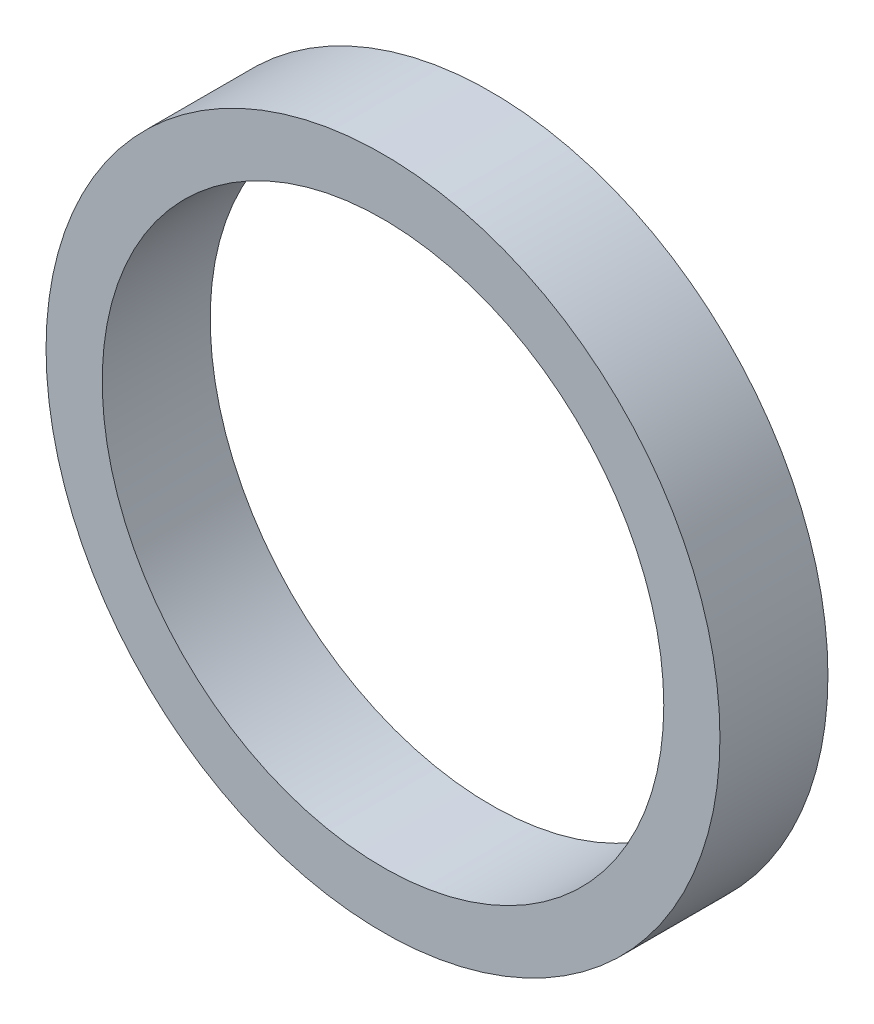
ISO-10303-21;
HEADER;
FILE_DESCRIPTION(('STEP AP214'),'2;1');
FILE_NAME('part.step','',(''),(''),'','','');
FILE_SCHEMA(('AUTOMOTIVE_DESIGN { 1 0 10303 214 1 1 1 1 }'));
ENDSEC;
DATA;
#1=APPLICATION_CONTEXT('core data for automotive mechanical design processes');
#2=APPLICATION_PROTOCOL_DEFINITION('international standard','automotive_design',2000,#1);
#3=PRODUCT_CONTEXT('',#1,'mechanical');
#4=PRODUCT('Part','Part','',(#3));
#5=PRODUCT_RELATED_PRODUCT_CATEGORY('part','',(#4));
#6=PRODUCT_DEFINITION_FORMATION('','',#4);
#7=PRODUCT_DEFINITION_CONTEXT('part definition',#1,'design');
#8=PRODUCT_DEFINITION('design','',#6,#7);
#9=PRODUCT_DEFINITION_SHAPE('','',#8);
#10=(LENGTH_UNIT() NAMED_UNIT(*) SI_UNIT(.MILLI.,.METRE.));
#11=(NAMED_UNIT(*) PLANE_ANGLE_UNIT() SI_UNIT($,.RADIAN.));
#12=(NAMED_UNIT(*) SI_UNIT($,.STERADIAN.) SOLID_ANGLE_UNIT());
#13=UNCERTAINTY_MEASURE_WITH_UNIT(LENGTH_MEASURE(1.E-05),#10,'distance_accuracy_value','');
#14=(GEOMETRIC_REPRESENTATION_CONTEXT(3) GLOBAL_UNCERTAINTY_ASSIGNED_CONTEXT((#13)) GLOBAL_UNIT_ASSIGNED_CONTEXT((#10,
#11,#12)) REPRESENTATION_CONTEXT('',''));
#15=CARTESIAN_POINT('',(0.,0.,0.));
#16=DIRECTION('',(0.,0.,1.));
#17=DIRECTION('',(1.,0.,0.));
#18=AXIS2_PLACEMENT_3D('',#15,#16,#17);
#19=CARTESIAN_POINT('',(0.,0.,5.));
#20=DIRECTION('',(0.,0.,1.));
#21=DIRECTION('',(1.,0.,0.));
#22=AXIS2_PLACEMENT_3D('',#19,#20,#21);
#23=PLANE('',#22);
#24=CARTESIAN_POINT('',(0.,0.,5.));
#25=DIRECTION('',(0.,0.,1.));
#26=DIRECTION('',(1.,0.,0.));
#27=AXIS2_PLACEMENT_3D('',#24,#25,#26);
#28=CIRCLE('',#27,15.6);
#29=CARTESIAN_POINT('',(15.6,0.,5.));
#30=VERTEX_POINT('',#29);
#31=EDGE_CURVE('E10',#30,#30,#28,.T.);
#32=ORIENTED_EDGE('',*,*,#31,.T.);
#33=EDGE_LOOP('',(#32));
#34=FACE_BOUND('',#33,.T.);
#35=CARTESIAN_POINT('',(0.,0.,5.));
#36=DIRECTION('',(0.,0.,1.));
#37=DIRECTION('',(1.,0.,0.));
#38=AXIS2_PLACEMENT_3D('',#35,#36,#37);
#39=CIRCLE('',#38,13.);
#40=CARTESIAN_POINT('',(13.,0.,5.));
#41=VERTEX_POINT('',#40);
#42=EDGE_CURVE('E50',#41,#41,#39,.T.);
#43=ORIENTED_EDGE('',*,*,#42,.F.);
#44=EDGE_LOOP('',(#43));
#45=FACE_BOUND('',#44,.T.);
#46=ADVANCED_FACE('F37',(#34,#45),#23,.T.);
#47=CARTESIAN_POINT('',(0.,0.,0.));
#48=DIRECTION('',(0.,0.,1.));
#49=DIRECTION('',(1.,0.,0.));
#50=AXIS2_PLACEMENT_3D('',#47,#48,#49);
#51=PLANE('',#50);
#52=CARTESIAN_POINT('',(0.,0.,0.));
#53=DIRECTION('',(0.,0.,1.));
#54=DIRECTION('',(1.,0.,0.));
#55=AXIS2_PLACEMENT_3D('',#52,#53,#54);
#56=CIRCLE('',#55,15.6);
#57=CARTESIAN_POINT('',(15.6,0.,0.));
#58=VERTEX_POINT('',#57);
#59=EDGE_CURVE('E41',#58,#58,#56,.T.);
#60=ORIENTED_EDGE('',*,*,#59,.F.);
#61=EDGE_LOOP('',(#60));
#62=FACE_BOUND('',#61,.T.);
#63=CARTESIAN_POINT('',(0.,0.,0.));
#64=DIRECTION('',(0.,0.,1.));
#65=DIRECTION('',(1.,0.,0.));
#66=AXIS2_PLACEMENT_3D('',#63,#64,#65);
#67=CIRCLE('',#66,13.);
#68=CARTESIAN_POINT('',(13.,0.,0.));
#69=VERTEX_POINT('',#68);
#70=EDGE_CURVE('E52',#69,#69,#67,.T.);
#71=ORIENTED_EDGE('',*,*,#70,.T.);
#72=EDGE_LOOP('',(#71));
#73=FACE_BOUND('',#72,.T.);
#74=ADVANCED_FACE('F64',(#62,#73),#51,.F.);
#75=CARTESIAN_POINT('',(0.,0.,5.));
#76=DIRECTION('',(0.,0.,-1.));
#77=DIRECTION('',(-1.,0.,0.));
#78=AXIS2_PLACEMENT_3D('',#75,#76,#77);
#79=CYLINDRICAL_SURFACE('',#78,15.6);
#80=ORIENTED_EDGE('',*,*,#31,.F.);
#81=EDGE_LOOP('',(#80));
#82=FACE_BOUND('',#81,.T.);
#83=ORIENTED_EDGE('',*,*,#59,.T.);
#84=EDGE_LOOP('',(#83));
#85=FACE_BOUND('',#84,.T.);
#86=ADVANCED_FACE('F39',(#82,#85),#79,.T.);
#87=CARTESIAN_POINT('',(0.,0.,5.));
#88=DIRECTION('',(0.,0.,-1.));
#89=DIRECTION('',(-1.,0.,0.));
#90=AXIS2_PLACEMENT_3D('',#87,#88,#89);
#91=CYLINDRICAL_SURFACE('',#90,13.);
#92=ORIENTED_EDGE('',*,*,#42,.T.);
#93=EDGE_LOOP('',(#92));
#94=FACE_BOUND('',#93,.T.);
#95=ORIENTED_EDGE('',*,*,#70,.F.);
#96=EDGE_LOOP('',(#95));
#97=FACE_BOUND('',#96,.T.);
#98=ADVANCED_FACE('F60',(#94,#97),#91,.F.);
#99=CLOSED_SHELL('',(#46,#74,#86,#98));
#100=MANIFOLD_SOLID_BREP('B2',#99);
#101=ADVANCED_BREP_SHAPE_REPRESENTATION('',(#18,#100),#14);
#102=SHAPE_DEFINITION_REPRESENTATION(#9,#101);
ENDSEC;
END-ISO-10303-21;
